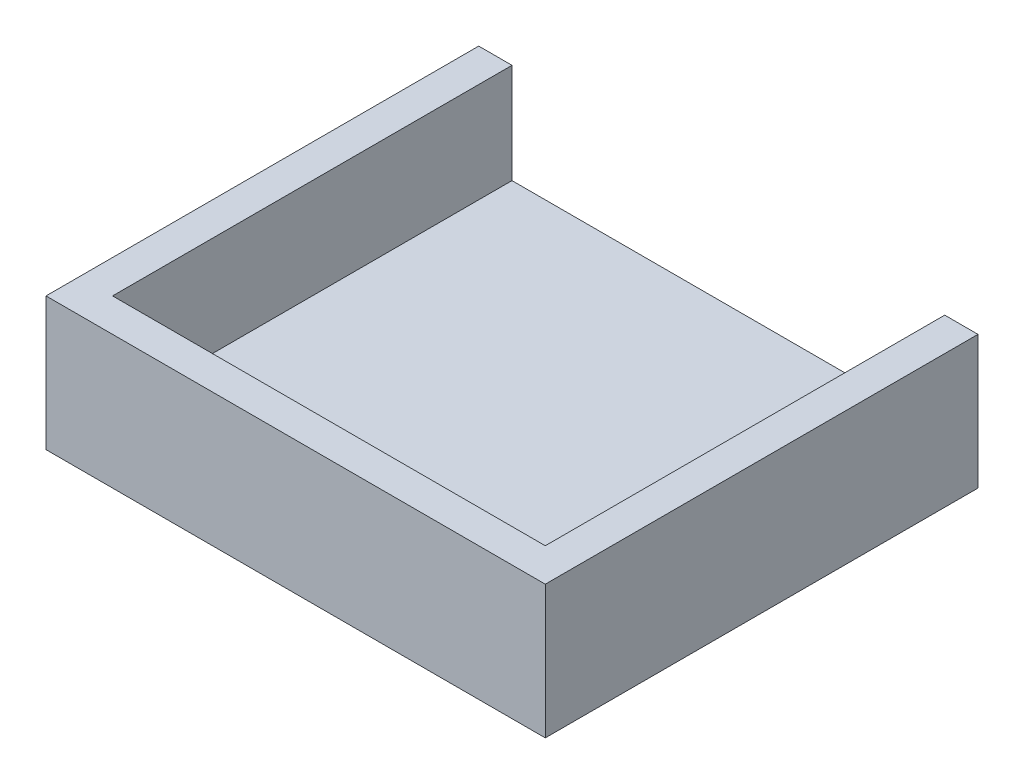
ISO-10303-21;
HEADER;
FILE_DESCRIPTION(('STEP AP214'),'2;1');
FILE_NAME('part.step','',(''),(''),'','','');
FILE_SCHEMA(('AUTOMOTIVE_DESIGN { 1 0 10303 214 1 1 1 1 }'));
ENDSEC;
DATA;
#1=APPLICATION_CONTEXT('core data for automotive mechanical design processes');
#2=APPLICATION_PROTOCOL_DEFINITION('international standard','automotive_design',2000,#1);
#3=PRODUCT_CONTEXT('',#1,'mechanical');
#4=PRODUCT('Part','Part','',(#3));
#5=PRODUCT_RELATED_PRODUCT_CATEGORY('part','',(#4));
#6=PRODUCT_DEFINITION_FORMATION('','',#4);
#7=PRODUCT_DEFINITION_CONTEXT('part definition',#1,'design');
#8=PRODUCT_DEFINITION('design','',#6,#7);
#9=PRODUCT_DEFINITION_SHAPE('','',#8);
#10=(LENGTH_UNIT() NAMED_UNIT(*) SI_UNIT(.MILLI.,.METRE.));
#11=(NAMED_UNIT(*) PLANE_ANGLE_UNIT() SI_UNIT($,.RADIAN.));
#12=(NAMED_UNIT(*) SI_UNIT($,.STERADIAN.) SOLID_ANGLE_UNIT());
#13=UNCERTAINTY_MEASURE_WITH_UNIT(LENGTH_MEASURE(1.E-05),#10,'distance_accuracy_value','');
#14=(GEOMETRIC_REPRESENTATION_CONTEXT(3) GLOBAL_UNCERTAINTY_ASSIGNED_CONTEXT((#13)) GLOBAL_UNIT_ASSIGNED_CONTEXT((#10,
#11,#12)) REPRESENTATION_CONTEXT('',''));
#15=CARTESIAN_POINT('',(0.,0.,0.));
#16=DIRECTION('',(0.,0.,1.));
#17=DIRECTION('',(1.,0.,0.));
#18=AXIS2_PLACEMENT_3D('',#15,#16,#17);
#19=CARTESIAN_POINT('',(7.5,4.,-6.5));
#20=DIRECTION('',(0.,0.,1.));
#21=DIRECTION('',(1.,0.,0.));
#22=AXIS2_PLACEMENT_3D('',#19,#20,#21);
#23=PLANE('',#22);
#24=DIRECTION('',(0.,1.,0.));
#25=VECTOR('',#24,1.);
#26=CARTESIAN_POINT('',(-6.5,4.,-6.5));
#27=LINE('',#26,#25);
#28=CARTESIAN_POINT('',(-6.5,1.,-6.5));
#29=VERTEX_POINT('',#28);
#30=CARTESIAN_POINT('',(-6.5,4.,-6.5));
#31=VERTEX_POINT('',#30);
#32=EDGE_CURVE('E131',#29,#31,#27,.T.);
#33=ORIENTED_EDGE('',*,*,#32,.F.);
#34=DIRECTION('',(-1.,0.,0.));
#35=VECTOR('',#34,1.);
#36=CARTESIAN_POINT('',(7.5,1.,-6.5));
#37=LINE('',#36,#35);
#38=CARTESIAN_POINT('',(6.5,1.,-6.5));
#39=VERTEX_POINT('',#38);
#40=EDGE_CURVE('E11',#39,#29,#37,.T.);
#41=ORIENTED_EDGE('',*,*,#40,.F.);
#42=DIRECTION('',(0.,-1.,0.));
#43=VECTOR('',#42,1.);
#44=CARTESIAN_POINT('',(6.5,4.,-6.5));
#45=LINE('',#44,#43);
#46=CARTESIAN_POINT('',(6.5,4.,-6.5));
#47=VERTEX_POINT('',#46);
#48=EDGE_CURVE('E122',#47,#39,#45,.T.);
#49=ORIENTED_EDGE('',*,*,#48,.F.);
#50=DIRECTION('',(-1.,0.,0.));
#51=VECTOR('',#50,1.);
#52=CARTESIAN_POINT('',(7.5,4.,-6.5));
#53=LINE('',#52,#51);
#54=CARTESIAN_POINT('',(7.5,4.,-6.5));
#55=VERTEX_POINT('',#54);
#56=EDGE_CURVE('E139',#55,#47,#53,.T.);
#57=ORIENTED_EDGE('',*,*,#56,.F.);
#58=DIRECTION('',(0.,-1.,0.));
#59=VECTOR('',#58,1.);
#60=CARTESIAN_POINT('',(7.5,4.,-6.5));
#61=LINE('',#60,#59);
#62=CARTESIAN_POINT('',(7.5,0.,-6.5));
#63=VERTEX_POINT('',#62);
#64=EDGE_CURVE('E151',#55,#63,#61,.T.);
#65=ORIENTED_EDGE('',*,*,#64,.T.);
#66=DIRECTION('',(-1.,0.,0.));
#67=VECTOR('',#66,1.);
#68=CARTESIAN_POINT('',(7.5,0.,-6.5));
#69=LINE('',#68,#67);
#70=CARTESIAN_POINT('',(-7.5,0.,-6.5));
#71=VERTEX_POINT('',#70);
#72=EDGE_CURVE('E78',#63,#71,#69,.T.);
#73=ORIENTED_EDGE('',*,*,#72,.T.);
#74=DIRECTION('',(0.,-1.,0.));
#75=VECTOR('',#74,1.);
#76=CARTESIAN_POINT('',(-7.5,4.,-6.5));
#77=LINE('',#76,#75);
#78=CARTESIAN_POINT('',(-7.5,4.,-6.5));
#79=VERTEX_POINT('',#78);
#80=EDGE_CURVE('E142',#79,#71,#77,.T.);
#81=ORIENTED_EDGE('',*,*,#80,.F.);
#82=EDGE_CURVE('E56',#31,#79,#53,.T.);
#83=ORIENTED_EDGE('',*,*,#82,.F.);
#84=EDGE_LOOP('',(#33,#41,#49,#57,#65,#73,#81,#83));
#85=FACE_BOUND('',#84,.T.);
#86=ADVANCED_FACE('F32',(#85),#23,.F.);
#87=CARTESIAN_POINT('',(0.,4.,0.));
#88=DIRECTION('',(0.,1.,0.));
#89=DIRECTION('',(0.,0.,1.));
#90=AXIS2_PLACEMENT_3D('',#87,#88,#89);
#91=PLANE('',#90);
#92=DIRECTION('',(-1.,0.,0.));
#93=VECTOR('',#92,1.);
#94=CARTESIAN_POINT('',(0.,4.,5.5));
#95=LINE('',#94,#93);
#96=CARTESIAN_POINT('',(6.5,4.,5.5));
#97=VERTEX_POINT('',#96);
#98=CARTESIAN_POINT('',(-6.5,4.,5.5));
#99=VERTEX_POINT('',#98);
#100=EDGE_CURVE('E161',#97,#99,#95,.T.);
#101=ORIENTED_EDGE('',*,*,#100,.T.);
#102=DIRECTION('',(0.,0.,-1.));
#103=VECTOR('',#102,1.);
#104=CARTESIAN_POINT('',(-6.5,4.,0.));
#105=LINE('',#104,#103);
#106=EDGE_CURVE('E40',#99,#31,#105,.T.);
#107=ORIENTED_EDGE('',*,*,#106,.T.);
#108=ORIENTED_EDGE('',*,*,#82,.T.);
#109=DIRECTION('',(0.,0.,1.));
#110=VECTOR('',#109,1.);
#111=CARTESIAN_POINT('',(-7.5,4.,6.5));
#112=LINE('',#111,#110);
#113=CARTESIAN_POINT('',(-7.5,4.,6.5));
#114=VERTEX_POINT('',#113);
#115=EDGE_CURVE('E134',#79,#114,#112,.T.);
#116=ORIENTED_EDGE('',*,*,#115,.T.);
#117=DIRECTION('',(1.,0.,0.));
#118=VECTOR('',#117,1.);
#119=CARTESIAN_POINT('',(7.5,4.,6.5));
#120=LINE('',#119,#118);
#121=CARTESIAN_POINT('',(7.5,4.,6.5));
#122=VERTEX_POINT('',#121);
#123=EDGE_CURVE('E86',#114,#122,#120,.T.);
#124=ORIENTED_EDGE('',*,*,#123,.T.);
#125=DIRECTION('',(0.,0.,-1.));
#126=VECTOR('',#125,1.);
#127=CARTESIAN_POINT('',(7.5,4.,6.5));
#128=LINE('',#127,#126);
#129=EDGE_CURVE('E137',#122,#55,#128,.T.);
#130=ORIENTED_EDGE('',*,*,#129,.T.);
#131=ORIENTED_EDGE('',*,*,#56,.T.);
#132=DIRECTION('',(0.,0.,1.));
#133=VECTOR('',#132,1.);
#134=CARTESIAN_POINT('',(6.5,4.,0.));
#135=LINE('',#134,#133);
#136=EDGE_CURVE('E158',#47,#97,#135,.T.);
#137=ORIENTED_EDGE('',*,*,#136,.T.);
#138=EDGE_LOOP('',(#101,#107,#108,#116,#124,#130,#131,#137));
#139=FACE_BOUND('',#138,.T.);
#140=ADVANCED_FACE('F162',(#139),#91,.T.);
#141=CARTESIAN_POINT('',(-7.5,4.,6.5));
#142=DIRECTION('',(1.,0.,0.));
#143=DIRECTION('',(0.,0.,-1.));
#144=AXIS2_PLACEMENT_3D('',#141,#142,#143);
#145=PLANE('',#144);
#146=DIRECTION('',(0.,0.,1.));
#147=VECTOR('',#146,1.);
#148=CARTESIAN_POINT('',(-7.5,0.,6.5));
#149=LINE('',#148,#147);
#150=CARTESIAN_POINT('',(-7.5,0.,6.5));
#151=VERTEX_POINT('',#150);
#152=EDGE_CURVE('E133',#71,#151,#149,.T.);
#153=ORIENTED_EDGE('',*,*,#152,.T.);
#154=DIRECTION('',(0.,-1.,0.));
#155=VECTOR('',#154,1.);
#156=CARTESIAN_POINT('',(-7.5,4.,6.5));
#157=LINE('',#156,#155);
#158=EDGE_CURVE('E156',#114,#151,#157,.T.);
#159=ORIENTED_EDGE('',*,*,#158,.F.);
#160=ORIENTED_EDGE('',*,*,#115,.F.);
#161=ORIENTED_EDGE('',*,*,#80,.T.);
#162=EDGE_LOOP('',(#153,#159,#160,#161));
#163=FACE_BOUND('',#162,.T.);
#164=ADVANCED_FACE('F34',(#163),#145,.F.);
#165=CARTESIAN_POINT('',(7.5,4.,6.5));
#166=DIRECTION('',(0.,0.,-1.));
#167=DIRECTION('',(-1.,0.,0.));
#168=AXIS2_PLACEMENT_3D('',#165,#166,#167);
#169=PLANE('',#168);
#170=DIRECTION('',(1.,0.,0.));
#171=VECTOR('',#170,1.);
#172=CARTESIAN_POINT('',(7.5,0.,6.5));
#173=LINE('',#172,#171);
#174=CARTESIAN_POINT('',(7.5,0.,6.5));
#175=VERTEX_POINT('',#174);
#176=EDGE_CURVE('E145',#151,#175,#173,.T.);
#177=ORIENTED_EDGE('',*,*,#176,.T.);
#178=DIRECTION('',(0.,-1.,0.));
#179=VECTOR('',#178,1.);
#180=CARTESIAN_POINT('',(7.5,4.,6.5));
#181=LINE('',#180,#179);
#182=EDGE_CURVE('E153',#122,#175,#181,.T.);
#183=ORIENTED_EDGE('',*,*,#182,.F.);
#184=ORIENTED_EDGE('',*,*,#123,.F.);
#185=ORIENTED_EDGE('',*,*,#158,.T.);
#186=EDGE_LOOP('',(#177,#183,#184,#185));
#187=FACE_BOUND('',#186,.T.);
#188=ADVANCED_FACE('F169',(#187),#169,.F.);
#189=CARTESIAN_POINT('',(7.5,4.,6.5));
#190=DIRECTION('',(-1.,0.,0.));
#191=DIRECTION('',(0.,0.,1.));
#192=AXIS2_PLACEMENT_3D('',#189,#190,#191);
#193=PLANE('',#192);
#194=DIRECTION('',(0.,0.,-1.));
#195=VECTOR('',#194,1.);
#196=CARTESIAN_POINT('',(7.5,0.,6.5));
#197=LINE('',#196,#195);
#198=EDGE_CURVE('E147',#175,#63,#197,.T.);
#199=ORIENTED_EDGE('',*,*,#198,.T.);
#200=ORIENTED_EDGE('',*,*,#64,.F.);
#201=ORIENTED_EDGE('',*,*,#129,.F.);
#202=ORIENTED_EDGE('',*,*,#182,.T.);
#203=EDGE_LOOP('',(#199,#200,#201,#202));
#204=FACE_BOUND('',#203,.T.);
#205=ADVANCED_FACE('F172',(#204),#193,.F.);
#206=CARTESIAN_POINT('',(0.,0.,0.));
#207=DIRECTION('',(0.,1.,0.));
#208=DIRECTION('',(0.,0.,1.));
#209=AXIS2_PLACEMENT_3D('',#206,#207,#208);
#210=PLANE('',#209);
#211=ORIENTED_EDGE('',*,*,#152,.F.);
#212=ORIENTED_EDGE('',*,*,#72,.F.);
#213=ORIENTED_EDGE('',*,*,#198,.F.);
#214=ORIENTED_EDGE('',*,*,#176,.F.);
#215=EDGE_LOOP('',(#211,#212,#213,#214));
#216=FACE_BOUND('',#215,.T.);
#217=ADVANCED_FACE('F193',(#216),#210,.F.);
#218=CARTESIAN_POINT('',(0.,1.,0.));
#219=DIRECTION('',(0.,1.,0.));
#220=DIRECTION('',(0.,0.,1.));
#221=AXIS2_PLACEMENT_3D('',#218,#219,#220);
#222=PLANE('',#221);
#223=ORIENTED_EDGE('',*,*,#40,.T.);
#224=DIRECTION('',(0.,0.,1.));
#225=VECTOR('',#224,1.);
#226=CARTESIAN_POINT('',(-6.5,1.,-9.5));
#227=LINE('',#226,#225);
#228=CARTESIAN_POINT('',(-6.5,1.,5.5));
#229=VERTEX_POINT('',#228);
#230=EDGE_CURVE('E107',#29,#229,#227,.T.);
#231=ORIENTED_EDGE('',*,*,#230,.T.);
#232=DIRECTION('',(1.,0.,0.));
#233=VECTOR('',#232,1.);
#234=CARTESIAN_POINT('',(-6.5,1.,5.5));
#235=LINE('',#234,#233);
#236=CARTESIAN_POINT('',(6.5,1.,5.5));
#237=VERTEX_POINT('',#236);
#238=EDGE_CURVE('E112',#229,#237,#235,.T.);
#239=ORIENTED_EDGE('',*,*,#238,.T.);
#240=DIRECTION('',(0.,0.,-1.));
#241=VECTOR('',#240,1.);
#242=CARTESIAN_POINT('',(6.5,1.,-9.5));
#243=LINE('',#242,#241);
#244=EDGE_CURVE('E125',#237,#39,#243,.T.);
#245=ORIENTED_EDGE('',*,*,#244,.T.);
#246=EDGE_LOOP('',(#223,#231,#239,#245));
#247=FACE_BOUND('',#246,.T.);
#248=ADVANCED_FACE('F109',(#247),#222,.T.);
#249=CARTESIAN_POINT('',(-6.5,5.,-9.5));
#250=DIRECTION('',(1.,0.,0.));
#251=DIRECTION('',(0.,0.,-1.));
#252=AXIS2_PLACEMENT_3D('',#249,#250,#251);
#253=PLANE('',#252);
#254=ORIENTED_EDGE('',*,*,#32,.T.);
#255=ORIENTED_EDGE('',*,*,#106,.F.);
#256=DIRECTION('',(0.,-1.,0.));
#257=VECTOR('',#256,1.);
#258=CARTESIAN_POINT('',(-6.5,5.,5.5));
#259=LINE('',#258,#257);
#260=EDGE_CURVE('E118',#99,#229,#259,.T.);
#261=ORIENTED_EDGE('',*,*,#260,.T.);
#262=ORIENTED_EDGE('',*,*,#230,.F.);
#263=EDGE_LOOP('',(#254,#255,#261,#262));
#264=FACE_BOUND('',#263,.T.);
#265=ADVANCED_FACE('F119',(#264),#253,.T.);
#266=CARTESIAN_POINT('',(6.5,5.,-9.5));
#267=DIRECTION('',(-1.,0.,0.));
#268=DIRECTION('',(0.,0.,1.));
#269=AXIS2_PLACEMENT_3D('',#266,#267,#268);
#270=PLANE('',#269);
#271=ORIENTED_EDGE('',*,*,#48,.T.);
#272=ORIENTED_EDGE('',*,*,#244,.F.);
#273=DIRECTION('',(0.,-1.,0.));
#274=VECTOR('',#273,1.);
#275=CARTESIAN_POINT('',(6.5,5.,5.5));
#276=LINE('',#275,#274);
#277=EDGE_CURVE('E47',#97,#237,#276,.T.);
#278=ORIENTED_EDGE('',*,*,#277,.F.);
#279=ORIENTED_EDGE('',*,*,#136,.F.);
#280=EDGE_LOOP('',(#271,#272,#278,#279));
#281=FACE_BOUND('',#280,.T.);
#282=ADVANCED_FACE('F175',(#281),#270,.T.);
#283=CARTESIAN_POINT('',(-6.5,5.,5.5));
#284=DIRECTION('',(0.,0.,-1.));
#285=DIRECTION('',(-1.,0.,0.));
#286=AXIS2_PLACEMENT_3D('',#283,#284,#285);
#287=PLANE('',#286);
#288=ORIENTED_EDGE('',*,*,#277,.T.);
#289=ORIENTED_EDGE('',*,*,#238,.F.);
#290=ORIENTED_EDGE('',*,*,#260,.F.);
#291=ORIENTED_EDGE('',*,*,#100,.F.);
#292=EDGE_LOOP('',(#288,#289,#290,#291));
#293=FACE_BOUND('',#292,.T.);
#294=ADVANCED_FACE('F124',(#293),#287,.T.);
#295=CLOSED_SHELL('',(#86,#140,#164,#188,#205,#217,#248,#265,#282,#294));
#296=MANIFOLD_SOLID_BREP('B2',#295);
#297=ADVANCED_BREP_SHAPE_REPRESENTATION('',(#18,#296),#14);
#298=SHAPE_DEFINITION_REPRESENTATION(#9,#297);
ENDSEC;
END-ISO-10303-21;
